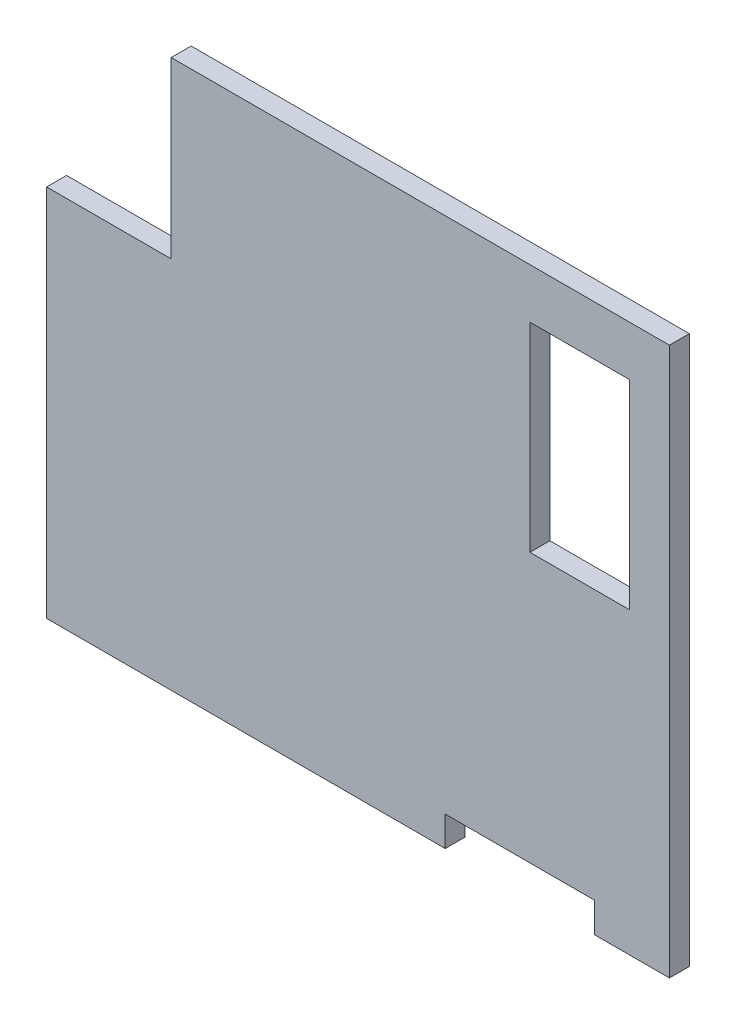
ISO-10303-21;
HEADER;
FILE_DESCRIPTION(('STEP AP214'),'2;1');
FILE_NAME('part.step','',(''),(''),'','','');
FILE_SCHEMA(('AUTOMOTIVE_DESIGN { 1 0 10303 214 1 1 1 1 }'));
ENDSEC;
DATA;
#1=APPLICATION_CONTEXT('core data for automotive mechanical design processes');
#2=APPLICATION_PROTOCOL_DEFINITION('international standard','automotive_design',2000,#1);
#3=PRODUCT_CONTEXT('',#1,'mechanical');
#4=PRODUCT('Part','Part','',(#3));
#5=PRODUCT_RELATED_PRODUCT_CATEGORY('part','',(#4));
#6=PRODUCT_DEFINITION_FORMATION('','',#4);
#7=PRODUCT_DEFINITION_CONTEXT('part definition',#1,'design');
#8=PRODUCT_DEFINITION('design','',#6,#7);
#9=PRODUCT_DEFINITION_SHAPE('','',#8);
#10=(LENGTH_UNIT() NAMED_UNIT(*) SI_UNIT(.MILLI.,.METRE.));
#11=(NAMED_UNIT(*) PLANE_ANGLE_UNIT() SI_UNIT($,.RADIAN.));
#12=(NAMED_UNIT(*) SI_UNIT($,.STERADIAN.) SOLID_ANGLE_UNIT());
#13=UNCERTAINTY_MEASURE_WITH_UNIT(LENGTH_MEASURE(1.E-05),#10,'distance_accuracy_value','');
#14=(GEOMETRIC_REPRESENTATION_CONTEXT(3) GLOBAL_UNCERTAINTY_ASSIGNED_CONTEXT((#13)) GLOBAL_UNIT_ASSIGNED_CONTEXT((#10,
#11,#12)) REPRESENTATION_CONTEXT('',''));
#15=CARTESIAN_POINT('',(0.,0.,0.));
#16=DIRECTION('',(0.,0.,1.));
#17=DIRECTION('',(1.,0.,0.));
#18=AXIS2_PLACEMENT_3D('',#15,#16,#17);
#19=CARTESIAN_POINT('',(0.,0.,4.));
#20=DIRECTION('',(0.,0.,1.));
#21=DIRECTION('',(1.,0.,0.));
#22=AXIS2_PLACEMENT_3D('',#19,#20,#21);
#23=PLANE('',#22);
#24=DIRECTION('',(0.,-1.,0.));
#25=VECTOR('',#24,1.);
#26=CARTESIAN_POINT('',(0.,75.,4.));
#27=LINE('',#26,#25);
#28=CARTESIAN_POINT('',(0.,75.,4.));
#29=VERTEX_POINT('',#28);
#30=CARTESIAN_POINT('',(0.,0.,4.));
#31=VERTEX_POINT('',#30);
#32=EDGE_CURVE('E189',#29,#31,#27,.T.);
#33=ORIENTED_EDGE('',*,*,#32,.T.);
#34=DIRECTION('',(1.,0.,0.));
#35=VECTOR('',#34,1.);
#36=CARTESIAN_POINT('',(0.,0.,4.));
#37=LINE('',#36,#35);
#38=CARTESIAN_POINT('',(80.,0.,4.));
#39=VERTEX_POINT('',#38);
#40=EDGE_CURVE('E193',#31,#39,#37,.T.);
#41=ORIENTED_EDGE('',*,*,#40,.T.);
#42=DIRECTION('',(0.,1.,0.));
#43=VECTOR('',#42,1.);
#44=CARTESIAN_POINT('',(80.,0.,4.));
#45=LINE('',#44,#43);
#46=CARTESIAN_POINT('',(80.,6.,4.));
#47=VERTEX_POINT('',#46);
#48=EDGE_CURVE('E197',#39,#47,#45,.T.);
#49=ORIENTED_EDGE('',*,*,#48,.T.);
#50=DIRECTION('',(1.,0.,0.));
#51=VECTOR('',#50,1.);
#52=CARTESIAN_POINT('',(80.,6.,4.));
#53=LINE('',#52,#51);
#54=CARTESIAN_POINT('',(110.,6.,4.));
#55=VERTEX_POINT('',#54);
#56=EDGE_CURVE('E200',#47,#55,#53,.T.);
#57=ORIENTED_EDGE('',*,*,#56,.T.);
#58=DIRECTION('',(0.,-1.,0.));
#59=VECTOR('',#58,1.);
#60=CARTESIAN_POINT('',(110.,6.,4.));
#61=LINE('',#60,#59);
#62=CARTESIAN_POINT('',(110.,0.,4.));
#63=VERTEX_POINT('',#62);
#64=EDGE_CURVE('E203',#55,#63,#61,.T.);
#65=ORIENTED_EDGE('',*,*,#64,.T.);
#66=DIRECTION('',(1.,0.,0.));
#67=VECTOR('',#66,1.);
#68=CARTESIAN_POINT('',(110.,0.,4.));
#69=LINE('',#68,#67);
#70=CARTESIAN_POINT('',(125.,0.,4.));
#71=VERTEX_POINT('',#70);
#72=EDGE_CURVE('E206',#63,#71,#69,.T.);
#73=ORIENTED_EDGE('',*,*,#72,.T.);
#74=DIRECTION('',(0.,1.,0.));
#75=VECTOR('',#74,1.);
#76=CARTESIAN_POINT('',(125.,0.,4.));
#77=LINE('',#76,#75);
#78=CARTESIAN_POINT('',(125.,110.,4.));
#79=VERTEX_POINT('',#78);
#80=EDGE_CURVE('E209',#71,#79,#77,.T.);
#81=ORIENTED_EDGE('',*,*,#80,.T.);
#82=DIRECTION('',(-1.,0.,0.));
#83=VECTOR('',#82,1.);
#84=CARTESIAN_POINT('',(125.,110.,4.));
#85=LINE('',#84,#83);
#86=CARTESIAN_POINT('',(25.,110.,4.));
#87=VERTEX_POINT('',#86);
#88=EDGE_CURVE('E212',#79,#87,#85,.T.);
#89=ORIENTED_EDGE('',*,*,#88,.T.);
#90=DIRECTION('',(0.,-1.,0.));
#91=VECTOR('',#90,1.);
#92=CARTESIAN_POINT('',(25.,110.,4.));
#93=LINE('',#92,#91);
#94=CARTESIAN_POINT('',(25.,75.,4.));
#95=VERTEX_POINT('',#94);
#96=EDGE_CURVE('E215',#87,#95,#93,.T.);
#97=ORIENTED_EDGE('',*,*,#96,.T.);
#98=DIRECTION('',(-1.,0.,0.));
#99=VECTOR('',#98,1.);
#100=CARTESIAN_POINT('',(25.,75.,4.));
#101=LINE('',#100,#99);
#102=EDGE_CURVE('E218',#95,#29,#101,.T.);
#103=ORIENTED_EDGE('',*,*,#102,.T.);
#104=EDGE_LOOP('',(#33,#41,#49,#57,#65,#73,#81,#89,#97,#103));
#105=FACE_BOUND('',#104,.T.);
#106=DIRECTION('',(-1.,0.,0.));
#107=VECTOR('',#106,1.);
#108=CARTESIAN_POINT('',(117.,100.,4.));
#109=LINE('',#108,#107);
#110=CARTESIAN_POINT('',(117.,100.,4.));
#111=VERTEX_POINT('',#110);
#112=CARTESIAN_POINT('',(97.,100.,4.));
#113=VERTEX_POINT('',#112);
#114=EDGE_CURVE('E150',#111,#113,#109,.T.);
#115=ORIENTED_EDGE('',*,*,#114,.F.);
#116=DIRECTION('',(0.,1.,0.));
#117=VECTOR('',#116,1.);
#118=CARTESIAN_POINT('',(117.,60.,4.));
#119=LINE('',#118,#117);
#120=CARTESIAN_POINT('',(117.,60.,4.));
#121=VERTEX_POINT('',#120);
#122=EDGE_CURVE('E141',#121,#111,#119,.T.);
#123=ORIENTED_EDGE('',*,*,#122,.F.);
#124=DIRECTION('',(1.,0.,0.));
#125=VECTOR('',#124,1.);
#126=CARTESIAN_POINT('',(97.,60.,4.));
#127=LINE('',#126,#125);
#128=CARTESIAN_POINT('',(97.,60.,4.));
#129=VERTEX_POINT('',#128);
#130=EDGE_CURVE('E167',#129,#121,#127,.T.);
#131=ORIENTED_EDGE('',*,*,#130,.F.);
#132=DIRECTION('',(0.,-1.,0.));
#133=VECTOR('',#132,1.);
#134=CARTESIAN_POINT('',(97.,100.,4.));
#135=LINE('',#134,#133);
#136=EDGE_CURVE('E163',#113,#129,#135,.T.);
#137=ORIENTED_EDGE('',*,*,#136,.F.);
#138=EDGE_LOOP('',(#115,#123,#131,#137));
#139=FACE_BOUND('',#138,.T.);
#140=ADVANCED_FACE('F39',(#105,#139),#23,.T.);
#141=CARTESIAN_POINT('',(0.,0.,0.));
#142=DIRECTION('',(0.,0.,1.));
#143=DIRECTION('',(1.,0.,0.));
#144=AXIS2_PLACEMENT_3D('',#141,#142,#143);
#145=PLANE('',#144);
#146=DIRECTION('',(0.,-1.,0.));
#147=VECTOR('',#146,1.);
#148=CARTESIAN_POINT('',(0.,75.,0.));
#149=LINE('',#148,#147);
#150=CARTESIAN_POINT('',(0.,75.,0.));
#151=VERTEX_POINT('',#150);
#152=CARTESIAN_POINT('',(0.,0.,0.));
#153=VERTEX_POINT('',#152);
#154=EDGE_CURVE('E159',#151,#153,#149,.T.);
#155=ORIENTED_EDGE('',*,*,#154,.F.);
#156=DIRECTION('',(-1.,0.,0.));
#157=VECTOR('',#156,1.);
#158=CARTESIAN_POINT('',(25.,75.,0.));
#159=LINE('',#158,#157);
#160=CARTESIAN_POINT('',(25.,75.,0.));
#161=VERTEX_POINT('',#160);
#162=EDGE_CURVE('E194',#161,#151,#159,.T.);
#163=ORIENTED_EDGE('',*,*,#162,.F.);
#164=DIRECTION('',(0.,-1.,0.));
#165=VECTOR('',#164,1.);
#166=CARTESIAN_POINT('',(25.,110.,0.));
#167=LINE('',#166,#165);
#168=CARTESIAN_POINT('',(25.,110.,0.));
#169=VERTEX_POINT('',#168);
#170=EDGE_CURVE('E246',#169,#161,#167,.T.);
#171=ORIENTED_EDGE('',*,*,#170,.F.);
#172=DIRECTION('',(-1.,0.,0.));
#173=VECTOR('',#172,1.);
#174=CARTESIAN_POINT('',(125.,110.,0.));
#175=LINE('',#174,#173);
#176=CARTESIAN_POINT('',(125.,110.,0.));
#177=VERTEX_POINT('',#176);
#178=EDGE_CURVE('E243',#177,#169,#175,.T.);
#179=ORIENTED_EDGE('',*,*,#178,.F.);
#180=DIRECTION('',(0.,1.,0.));
#181=VECTOR('',#180,1.);
#182=CARTESIAN_POINT('',(125.,0.,0.));
#183=LINE('',#182,#181);
#184=CARTESIAN_POINT('',(125.,0.,0.));
#185=VERTEX_POINT('',#184);
#186=EDGE_CURVE('E240',#185,#177,#183,.T.);
#187=ORIENTED_EDGE('',*,*,#186,.F.);
#188=DIRECTION('',(1.,0.,0.));
#189=VECTOR('',#188,1.);
#190=CARTESIAN_POINT('',(110.,0.,0.));
#191=LINE('',#190,#189);
#192=CARTESIAN_POINT('',(110.,0.,0.));
#193=VERTEX_POINT('',#192);
#194=EDGE_CURVE('E237',#193,#185,#191,.T.);
#195=ORIENTED_EDGE('',*,*,#194,.F.);
#196=DIRECTION('',(0.,-1.,0.));
#197=VECTOR('',#196,1.);
#198=CARTESIAN_POINT('',(110.,6.,0.));
#199=LINE('',#198,#197);
#200=CARTESIAN_POINT('',(110.,6.,0.));
#201=VERTEX_POINT('',#200);
#202=EDGE_CURVE('E234',#201,#193,#199,.T.);
#203=ORIENTED_EDGE('',*,*,#202,.F.);
#204=DIRECTION('',(1.,0.,0.));
#205=VECTOR('',#204,1.);
#206=CARTESIAN_POINT('',(80.,6.,0.));
#207=LINE('',#206,#205);
#208=CARTESIAN_POINT('',(80.,6.,0.));
#209=VERTEX_POINT('',#208);
#210=EDGE_CURVE('E231',#209,#201,#207,.T.);
#211=ORIENTED_EDGE('',*,*,#210,.F.);
#212=DIRECTION('',(0.,1.,0.));
#213=VECTOR('',#212,1.);
#214=CARTESIAN_POINT('',(80.,0.,0.));
#215=LINE('',#214,#213);
#216=CARTESIAN_POINT('',(80.,0.,0.));
#217=VERTEX_POINT('',#216);
#218=EDGE_CURVE('E228',#217,#209,#215,.T.);
#219=ORIENTED_EDGE('',*,*,#218,.F.);
#220=DIRECTION('',(1.,0.,0.));
#221=VECTOR('',#220,1.);
#222=CARTESIAN_POINT('',(0.,0.,0.));
#223=LINE('',#222,#221);
#224=EDGE_CURVE('E225',#153,#217,#223,.T.);
#225=ORIENTED_EDGE('',*,*,#224,.F.);
#226=EDGE_LOOP('',(#155,#163,#171,#179,#187,#195,#203,#211,#219,#225));
#227=FACE_BOUND('',#226,.T.);
#228=DIRECTION('',(0.,1.,0.));
#229=VECTOR('',#228,1.);
#230=CARTESIAN_POINT('',(117.,60.,0.));
#231=LINE('',#230,#229);
#232=CARTESIAN_POINT('',(117.,60.,0.));
#233=VERTEX_POINT('',#232);
#234=CARTESIAN_POINT('',(117.,100.,0.));
#235=VERTEX_POINT('',#234);
#236=EDGE_CURVE('E63',#233,#235,#231,.T.);
#237=ORIENTED_EDGE('',*,*,#236,.T.);
#238=DIRECTION('',(-1.,0.,0.));
#239=VECTOR('',#238,1.);
#240=CARTESIAN_POINT('',(117.,100.,0.));
#241=LINE('',#240,#239);
#242=CARTESIAN_POINT('',(97.,100.,0.));
#243=VERTEX_POINT('',#242);
#244=EDGE_CURVE('E157',#235,#243,#241,.T.);
#245=ORIENTED_EDGE('',*,*,#244,.T.);
#246=DIRECTION('',(0.,-1.,0.));
#247=VECTOR('',#246,1.);
#248=CARTESIAN_POINT('',(97.,100.,0.));
#249=LINE('',#248,#247);
#250=CARTESIAN_POINT('',(97.,60.,0.));
#251=VERTEX_POINT('',#250);
#252=EDGE_CURVE('E176',#243,#251,#249,.T.);
#253=ORIENTED_EDGE('',*,*,#252,.T.);
#254=DIRECTION('',(1.,0.,0.));
#255=VECTOR('',#254,1.);
#256=CARTESIAN_POINT('',(97.,60.,0.));
#257=LINE('',#256,#255);
#258=EDGE_CURVE('E151',#251,#233,#257,.T.);
#259=ORIENTED_EDGE('',*,*,#258,.T.);
#260=EDGE_LOOP('',(#237,#245,#253,#259));
#261=FACE_BOUND('',#260,.T.);
#262=ADVANCED_FACE('F293',(#227,#261),#145,.F.);
#263=CARTESIAN_POINT('',(0.,75.,4.));
#264=DIRECTION('',(1.,0.,0.));
#265=DIRECTION('',(0.,1.,0.));
#266=AXIS2_PLACEMENT_3D('',#263,#264,#265);
#267=PLANE('',#266);
#268=ORIENTED_EDGE('',*,*,#154,.T.);
#269=DIRECTION('',(0.,0.,-1.));
#270=VECTOR('',#269,1.);
#271=CARTESIAN_POINT('',(0.,0.,4.));
#272=LINE('',#271,#270);
#273=EDGE_CURVE('E11',#31,#153,#272,.T.);
#274=ORIENTED_EDGE('',*,*,#273,.F.);
#275=ORIENTED_EDGE('',*,*,#32,.F.);
#276=DIRECTION('',(0.,0.,-1.));
#277=VECTOR('',#276,1.);
#278=CARTESIAN_POINT('',(0.,75.,4.));
#279=LINE('',#278,#277);
#280=EDGE_CURVE('E221',#29,#151,#279,.T.);
#281=ORIENTED_EDGE('',*,*,#280,.T.);
#282=EDGE_LOOP('',(#268,#274,#275,#281));
#283=FACE_BOUND('',#282,.T.);
#284=ADVANCED_FACE('F41',(#283),#267,.F.);
#285=CARTESIAN_POINT('',(0.,0.,4.));
#286=DIRECTION('',(0.,1.,0.));
#287=DIRECTION('',(0.,0.,1.));
#288=AXIS2_PLACEMENT_3D('',#285,#286,#287);
#289=PLANE('',#288);
#290=ORIENTED_EDGE('',*,*,#224,.T.);
#291=DIRECTION('',(0.,0.,-1.));
#292=VECTOR('',#291,1.);
#293=CARTESIAN_POINT('',(80.,0.,4.));
#294=LINE('',#293,#292);
#295=EDGE_CURVE('E48',#39,#217,#294,.T.);
#296=ORIENTED_EDGE('',*,*,#295,.F.);
#297=ORIENTED_EDGE('',*,*,#40,.F.);
#298=ORIENTED_EDGE('',*,*,#273,.T.);
#299=EDGE_LOOP('',(#290,#296,#297,#298));
#300=FACE_BOUND('',#299,.T.);
#301=ADVANCED_FACE('F310',(#300),#289,.F.);
#302=CARTESIAN_POINT('',(80.,0.,4.));
#303=DIRECTION('',(-1.,0.,0.));
#304=DIRECTION('',(0.,0.,1.));
#305=AXIS2_PLACEMENT_3D('',#302,#303,#304);
#306=PLANE('',#305);
#307=ORIENTED_EDGE('',*,*,#218,.T.);
#308=DIRECTION('',(0.,0.,-1.));
#309=VECTOR('',#308,1.);
#310=CARTESIAN_POINT('',(80.,6.,4.));
#311=LINE('',#310,#309);
#312=EDGE_CURVE('E278',#47,#209,#311,.T.);
#313=ORIENTED_EDGE('',*,*,#312,.F.);
#314=ORIENTED_EDGE('',*,*,#48,.F.);
#315=ORIENTED_EDGE('',*,*,#295,.T.);
#316=EDGE_LOOP('',(#307,#313,#314,#315));
#317=FACE_BOUND('',#316,.T.);
#318=ADVANCED_FACE('F287',(#317),#306,.F.);
#319=CARTESIAN_POINT('',(80.,6.,4.));
#320=DIRECTION('',(0.,1.,0.));
#321=DIRECTION('',(0.,0.,1.));
#322=AXIS2_PLACEMENT_3D('',#319,#320,#321);
#323=PLANE('',#322);
#324=ORIENTED_EDGE('',*,*,#210,.T.);
#325=DIRECTION('',(0.,0.,-1.));
#326=VECTOR('',#325,1.);
#327=CARTESIAN_POINT('',(110.,6.,4.));
#328=LINE('',#327,#326);
#329=EDGE_CURVE('E274',#55,#201,#328,.T.);
#330=ORIENTED_EDGE('',*,*,#329,.F.);
#331=ORIENTED_EDGE('',*,*,#56,.F.);
#332=ORIENTED_EDGE('',*,*,#312,.T.);
#333=EDGE_LOOP('',(#324,#330,#331,#332));
#334=FACE_BOUND('',#333,.T.);
#335=ADVANCED_FACE('F299',(#334),#323,.F.);
#336=CARTESIAN_POINT('',(110.,6.,4.));
#337=DIRECTION('',(1.,0.,0.));
#338=DIRECTION('',(0.,0.,-1.));
#339=AXIS2_PLACEMENT_3D('',#336,#337,#338);
#340=PLANE('',#339);
#341=ORIENTED_EDGE('',*,*,#202,.T.);
#342=DIRECTION('',(0.,0.,-1.));
#343=VECTOR('',#342,1.);
#344=CARTESIAN_POINT('',(110.,0.,4.));
#345=LINE('',#344,#343);
#346=EDGE_CURVE('E270',#63,#193,#345,.T.);
#347=ORIENTED_EDGE('',*,*,#346,.F.);
#348=ORIENTED_EDGE('',*,*,#64,.F.);
#349=ORIENTED_EDGE('',*,*,#329,.T.);
#350=EDGE_LOOP('',(#341,#347,#348,#349));
#351=FACE_BOUND('',#350,.T.);
#352=ADVANCED_FACE('F303',(#351),#340,.F.);
#353=CARTESIAN_POINT('',(110.,0.,4.));
#354=DIRECTION('',(0.,1.,0.));
#355=DIRECTION('',(0.,0.,1.));
#356=AXIS2_PLACEMENT_3D('',#353,#354,#355);
#357=PLANE('',#356);
#358=ORIENTED_EDGE('',*,*,#194,.T.);
#359=DIRECTION('',(0.,0.,-1.));
#360=VECTOR('',#359,1.);
#361=CARTESIAN_POINT('',(125.,0.,4.));
#362=LINE('',#361,#360);
#363=EDGE_CURVE('E266',#71,#185,#362,.T.);
#364=ORIENTED_EDGE('',*,*,#363,.F.);
#365=ORIENTED_EDGE('',*,*,#72,.F.);
#366=ORIENTED_EDGE('',*,*,#346,.T.);
#367=EDGE_LOOP('',(#358,#364,#365,#366));
#368=FACE_BOUND('',#367,.T.);
#369=ADVANCED_FACE('F333',(#368),#357,.F.);
#370=CARTESIAN_POINT('',(125.,0.,4.));
#371=DIRECTION('',(-1.,0.,0.));
#372=DIRECTION('',(0.,0.,1.));
#373=AXIS2_PLACEMENT_3D('',#370,#371,#372);
#374=PLANE('',#373);
#375=ORIENTED_EDGE('',*,*,#186,.T.);
#376=DIRECTION('',(0.,0.,-1.));
#377=VECTOR('',#376,1.);
#378=CARTESIAN_POINT('',(125.,110.,4.));
#379=LINE('',#378,#377);
#380=EDGE_CURVE('E262',#79,#177,#379,.T.);
#381=ORIENTED_EDGE('',*,*,#380,.F.);
#382=ORIENTED_EDGE('',*,*,#80,.F.);
#383=ORIENTED_EDGE('',*,*,#363,.T.);
#384=EDGE_LOOP('',(#375,#381,#382,#383));
#385=FACE_BOUND('',#384,.T.);
#386=ADVANCED_FACE('F330',(#385),#374,.F.);
#387=CARTESIAN_POINT('',(125.,110.,4.));
#388=DIRECTION('',(0.,-1.,0.));
#389=DIRECTION('',(1.,0.,0.));
#390=AXIS2_PLACEMENT_3D('',#387,#388,#389);
#391=PLANE('',#390);
#392=ORIENTED_EDGE('',*,*,#178,.T.);
#393=DIRECTION('',(0.,0.,-1.));
#394=VECTOR('',#393,1.);
#395=CARTESIAN_POINT('',(25.,110.,4.));
#396=LINE('',#395,#394);
#397=EDGE_CURVE('E258',#87,#169,#396,.T.);
#398=ORIENTED_EDGE('',*,*,#397,.F.);
#399=ORIENTED_EDGE('',*,*,#88,.F.);
#400=ORIENTED_EDGE('',*,*,#380,.T.);
#401=EDGE_LOOP('',(#392,#398,#399,#400));
#402=FACE_BOUND('',#401,.T.);
#403=ADVANCED_FACE('F326',(#402),#391,.F.);
#404=CARTESIAN_POINT('',(25.,110.,4.));
#405=DIRECTION('',(1.,0.,0.));
#406=DIRECTION('',(0.,1.,0.));
#407=AXIS2_PLACEMENT_3D('',#404,#405,#406);
#408=PLANE('',#407);
#409=ORIENTED_EDGE('',*,*,#170,.T.);
#410=DIRECTION('',(0.,0.,-1.));
#411=VECTOR('',#410,1.);
#412=CARTESIAN_POINT('',(25.,75.,4.));
#413=LINE('',#412,#411);
#414=EDGE_CURVE('E254',#95,#161,#413,.T.);
#415=ORIENTED_EDGE('',*,*,#414,.F.);
#416=ORIENTED_EDGE('',*,*,#96,.F.);
#417=ORIENTED_EDGE('',*,*,#397,.T.);
#418=EDGE_LOOP('',(#409,#415,#416,#417));
#419=FACE_BOUND('',#418,.T.);
#420=ADVANCED_FACE('F322',(#419),#408,.F.);
#421=CARTESIAN_POINT('',(25.,75.,4.));
#422=DIRECTION('',(0.,-1.,0.));
#423=DIRECTION('',(0.,0.,-1.));
#424=AXIS2_PLACEMENT_3D('',#421,#422,#423);
#425=PLANE('',#424);
#426=ORIENTED_EDGE('',*,*,#162,.T.);
#427=ORIENTED_EDGE('',*,*,#280,.F.);
#428=ORIENTED_EDGE('',*,*,#102,.F.);
#429=ORIENTED_EDGE('',*,*,#414,.T.);
#430=EDGE_LOOP('',(#426,#427,#428,#429));
#431=FACE_BOUND('',#430,.T.);
#432=ADVANCED_FACE('F317',(#431),#425,.F.);
#433=CARTESIAN_POINT('',(117.,60.,4.));
#434=DIRECTION('',(-1.,0.,0.));
#435=DIRECTION('',(0.,0.,1.));
#436=AXIS2_PLACEMENT_3D('',#433,#434,#435);
#437=PLANE('',#436);
#438=ORIENTED_EDGE('',*,*,#236,.F.);
#439=DIRECTION('',(0.,0.,-1.));
#440=VECTOR('',#439,1.);
#441=CARTESIAN_POINT('',(117.,60.,4.));
#442=LINE('',#441,#440);
#443=EDGE_CURVE('E145',#121,#233,#442,.T.);
#444=ORIENTED_EDGE('',*,*,#443,.F.);
#445=ORIENTED_EDGE('',*,*,#122,.T.);
#446=DIRECTION('',(0.,0.,-1.));
#447=VECTOR('',#446,1.);
#448=CARTESIAN_POINT('',(117.,100.,4.));
#449=LINE('',#448,#447);
#450=EDGE_CURVE('E144',#111,#235,#449,.T.);
#451=ORIENTED_EDGE('',*,*,#450,.T.);
#452=EDGE_LOOP('',(#438,#444,#445,#451));
#453=FACE_BOUND('',#452,.T.);
#454=ADVANCED_FACE('F143',(#453),#437,.T.);
#455=CARTESIAN_POINT('',(117.,100.,4.));
#456=DIRECTION('',(0.,-1.,0.));
#457=DIRECTION('',(0.,0.,-1.));
#458=AXIS2_PLACEMENT_3D('',#455,#456,#457);
#459=PLANE('',#458);
#460=ORIENTED_EDGE('',*,*,#244,.F.);
#461=ORIENTED_EDGE('',*,*,#450,.F.);
#462=ORIENTED_EDGE('',*,*,#114,.T.);
#463=DIRECTION('',(0.,0.,-1.));
#464=VECTOR('',#463,1.);
#465=CARTESIAN_POINT('',(97.,100.,4.));
#466=LINE('',#465,#464);
#467=EDGE_CURVE('E160',#113,#243,#466,.T.);
#468=ORIENTED_EDGE('',*,*,#467,.T.);
#469=EDGE_LOOP('',(#460,#461,#462,#468));
#470=FACE_BOUND('',#469,.T.);
#471=ADVANCED_FACE('F154',(#470),#459,.T.);
#472=CARTESIAN_POINT('',(97.,100.,4.));
#473=DIRECTION('',(1.,0.,0.));
#474=DIRECTION('',(0.,0.,-1.));
#475=AXIS2_PLACEMENT_3D('',#472,#473,#474);
#476=PLANE('',#475);
#477=ORIENTED_EDGE('',*,*,#252,.F.);
#478=ORIENTED_EDGE('',*,*,#467,.F.);
#479=ORIENTED_EDGE('',*,*,#136,.T.);
#480=DIRECTION('',(0.,0.,-1.));
#481=VECTOR('',#480,1.);
#482=CARTESIAN_POINT('',(97.,60.,4.));
#483=LINE('',#482,#481);
#484=EDGE_CURVE('E55',#129,#251,#483,.T.);
#485=ORIENTED_EDGE('',*,*,#484,.T.);
#486=EDGE_LOOP('',(#477,#478,#479,#485));
#487=FACE_BOUND('',#486,.T.);
#488=ADVANCED_FACE('F379',(#487),#476,.T.);
#489=CARTESIAN_POINT('',(97.,60.,4.));
#490=DIRECTION('',(0.,1.,0.));
#491=DIRECTION('',(0.,0.,1.));
#492=AXIS2_PLACEMENT_3D('',#489,#490,#491);
#493=PLANE('',#492);
#494=ORIENTED_EDGE('',*,*,#258,.F.);
#495=ORIENTED_EDGE('',*,*,#484,.F.);
#496=ORIENTED_EDGE('',*,*,#130,.T.);
#497=ORIENTED_EDGE('',*,*,#443,.T.);
#498=EDGE_LOOP('',(#494,#495,#496,#497));
#499=FACE_BOUND('',#498,.T.);
#500=ADVANCED_FACE('F385',(#499),#493,.T.);
#501=CLOSED_SHELL('',(#140,#262,#284,#301,#318,#335,#352,#369,#386,#403,#420,#432,#454,#471,
#488,#500));
#502=MANIFOLD_SOLID_BREP('B2',#501);
#503=ADVANCED_BREP_SHAPE_REPRESENTATION('',(#18,#502),#14);
#504=SHAPE_DEFINITION_REPRESENTATION(#9,#503);
ENDSEC;
END-ISO-10303-21;
